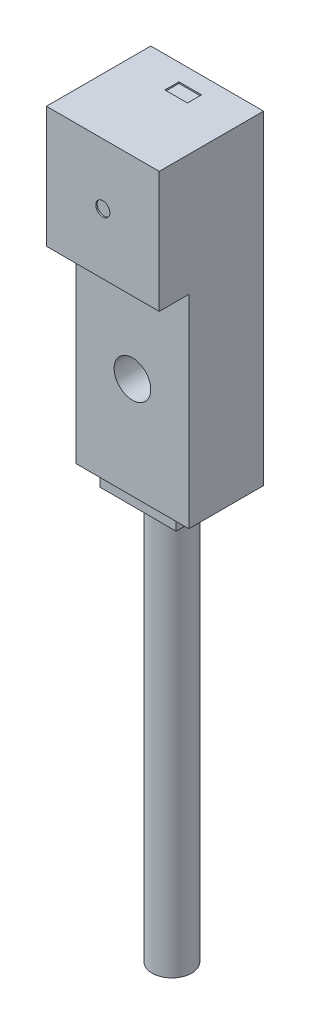
ISO-10303-21;
HEADER;
FILE_DESCRIPTION(('STEP AP214'),'2;1');
FILE_NAME('part.step','',(''),(''),'','','');
FILE_SCHEMA(('AUTOMOTIVE_DESIGN { 1 0 10303 214 1 1 1 1 }'));
ENDSEC;
DATA;
#1=APPLICATION_CONTEXT('core data for automotive mechanical design processes');
#2=APPLICATION_PROTOCOL_DEFINITION('international standard','automotive_design',2000,#1);
#3=PRODUCT_CONTEXT('',#1,'mechanical');
#4=PRODUCT('Part','Part','',(#3));
#5=PRODUCT_RELATED_PRODUCT_CATEGORY('part','',(#4));
#6=PRODUCT_DEFINITION_FORMATION('','',#4);
#7=PRODUCT_DEFINITION_CONTEXT('part definition',#1,'design');
#8=PRODUCT_DEFINITION('design','',#6,#7);
#9=PRODUCT_DEFINITION_SHAPE('','',#8);
#10=(LENGTH_UNIT() NAMED_UNIT(*) SI_UNIT(.MILLI.,.METRE.));
#11=(NAMED_UNIT(*) PLANE_ANGLE_UNIT() SI_UNIT($,.RADIAN.));
#12=(NAMED_UNIT(*) SI_UNIT($,.STERADIAN.) SOLID_ANGLE_UNIT());
#13=UNCERTAINTY_MEASURE_WITH_UNIT(LENGTH_MEASURE(1.E-05),#10,'distance_accuracy_value','');
#14=(GEOMETRIC_REPRESENTATION_CONTEXT(3) GLOBAL_UNCERTAINTY_ASSIGNED_CONTEXT((#13)) GLOBAL_UNIT_ASSIGNED_CONTEXT((#10,
#11,#12)) REPRESENTATION_CONTEXT('',''));
#15=CARTESIAN_POINT('',(0.,0.,0.));
#16=DIRECTION('',(0.,0.,1.));
#17=DIRECTION('',(1.,0.,0.));
#18=AXIS2_PLACEMENT_3D('',#15,#16,#17);
#19=CARTESIAN_POINT('',(1.4168,-48.7,-3.4832));
#20=DIRECTION('',(0.,-1.,0.));
#21=DIRECTION('',(-1.,0.,0.));
#22=AXIS2_PLACEMENT_3D('',#19,#20,#21);
#23=PLANE('',#22);
#24=CARTESIAN_POINT('',(0.,-48.7,-4.9));
#25=DIRECTION('',(0.,-1.,0.));
#26=DIRECTION('',(0.,0.,-1.));
#27=AXIS2_PLACEMENT_3D('',#24,#25,#26);
#28=CIRCLE('',#27,1.4);
#29=CARTESIAN_POINT('',(0.,-48.7,-6.3));
#30=VERTEX_POINT('',#29);
#31=EDGE_CURVE('E18',#30,#30,#28,.T.);
#32=ORIENTED_EDGE('',*,*,#31,.T.);
#33=EDGE_LOOP('',(#32));
#34=FACE_BOUND('',#33,.T.);
#35=ADVANCED_FACE('F14',(#34),#23,.T.);
#36=CARTESIAN_POINT('',(0.,-19.7,-4.9));
#37=DIRECTION('',(0.,-1.,0.));
#38=DIRECTION('',(0.,0.,-1.));
#39=AXIS2_PLACEMENT_3D('',#36,#37,#38);
#40=CYLINDRICAL_SURFACE('',#39,1.4);
#41=ORIENTED_EDGE('',*,*,#31,.F.);
#42=EDGE_LOOP('',(#41));
#43=FACE_BOUND('',#42,.T.);
#44=CARTESIAN_POINT('',(0.,-19.7,-4.9));
#45=DIRECTION('',(0.,-1.,0.));
#46=DIRECTION('',(0.,0.,-1.));
#47=AXIS2_PLACEMENT_3D('',#44,#45,#46);
#48=CIRCLE('',#47,1.4);
#49=CARTESIAN_POINT('',(0.,-19.7,-6.3));
#50=VERTEX_POINT('',#49);
#51=EDGE_CURVE('E159',#50,#50,#48,.T.);
#52=ORIENTED_EDGE('',*,*,#51,.T.);
#53=EDGE_LOOP('',(#52));
#54=FACE_BOUND('',#53,.T.);
#55=ADVANCED_FACE('F300',(#43,#54),#40,.T.);
#56=CARTESIAN_POINT('',(-0.8,4.2,-5.2));
#57=DIRECTION('',(0.,1.,0.));
#58=DIRECTION('',(1.,0.,0.));
#59=AXIS2_PLACEMENT_3D('',#56,#57,#58);
#60=PLANE('',#59);
#61=DIRECTION('',(-1.,0.,0.));
#62=VECTOR('',#61,1.);
#63=CARTESIAN_POINT('',(0.,4.2,-6.2));
#64=LINE('',#63,#62);
#65=CARTESIAN_POINT('',(0.8,4.2,-6.2));
#66=VERTEX_POINT('',#65);
#67=CARTESIAN_POINT('',(-0.8,4.2,-6.2));
#68=VERTEX_POINT('',#67);
#69=EDGE_CURVE('E172',#66,#68,#64,.T.);
#70=ORIENTED_EDGE('',*,*,#69,.T.);
#71=DIRECTION('',(0.,0.,1.));
#72=VECTOR('',#71,1.);
#73=CARTESIAN_POINT('',(-0.8,4.2,-5.7));
#74=LINE('',#73,#72);
#75=CARTESIAN_POINT('',(-0.8,4.2,-5.2));
#76=VERTEX_POINT('',#75);
#77=EDGE_CURVE('E164',#68,#76,#74,.T.);
#78=ORIENTED_EDGE('',*,*,#77,.T.);
#79=DIRECTION('',(1.,0.,0.));
#80=VECTOR('',#79,1.);
#81=CARTESIAN_POINT('',(0.,4.2,-5.2));
#82=LINE('',#81,#80);
#83=CARTESIAN_POINT('',(0.8,4.2,-5.2));
#84=VERTEX_POINT('',#83);
#85=EDGE_CURVE('E161',#76,#84,#82,.T.);
#86=ORIENTED_EDGE('',*,*,#85,.T.);
#87=DIRECTION('',(0.,0.,-1.));
#88=VECTOR('',#87,1.);
#89=CARTESIAN_POINT('',(0.8,4.2,-5.7));
#90=LINE('',#89,#88);
#91=EDGE_CURVE('E181',#84,#66,#90,.T.);
#92=ORIENTED_EDGE('',*,*,#91,.T.);
#93=EDGE_LOOP('',(#70,#78,#86,#92));
#94=FACE_BOUND('',#93,.T.);
#95=ADVANCED_FACE('F303',(#94),#60,.T.);
#96=CARTESIAN_POINT('',(2.7,-19.7,-2.5));
#97=DIRECTION('',(1.,0.,0.));
#98=DIRECTION('',(0.,0.,-1.));
#99=AXIS2_PLACEMENT_3D('',#96,#97,#98);
#100=PLANE('',#99);
#101=DIRECTION('',(0.,0.,1.));
#102=VECTOR('',#101,1.);
#103=CARTESIAN_POINT('',(2.7,-18.7,-4.75));
#104=LINE('',#103,#102);
#105=CARTESIAN_POINT('',(2.7,-18.699999998,-7.4));
#106=VERTEX_POINT('',#105);
#107=CARTESIAN_POINT('',(2.7,-18.7,-2.49999999985));
#108=VERTEX_POINT('',#107);
#109=EDGE_CURVE('E187',#106,#108,#104,.T.);
#110=ORIENTED_EDGE('',*,*,#109,.T.);
#111=DIRECTION('',(0.,1.,0.));
#112=VECTOR('',#111,1.);
#113=CARTESIAN_POINT('',(2.7,-19.2,-2.5));
#114=LINE('',#113,#112);
#115=CARTESIAN_POINT('',(2.7,-19.7,-2.5));
#116=VERTEX_POINT('',#115);
#117=EDGE_CURVE('E113',#116,#108,#114,.T.);
#118=ORIENTED_EDGE('',*,*,#117,.F.);
#119=DIRECTION('',(0.,0.,-1.));
#120=VECTOR('',#119,1.);
#121=CARTESIAN_POINT('',(2.7,-19.7,-4.95));
#122=LINE('',#121,#120);
#123=CARTESIAN_POINT('',(2.7,-19.7,-7.4));
#124=VERTEX_POINT('',#123);
#125=EDGE_CURVE('E137',#116,#124,#122,.T.);
#126=ORIENTED_EDGE('',*,*,#125,.T.);
#127=DIRECTION('',(0.,1.,0.));
#128=VECTOR('',#127,1.);
#129=CARTESIAN_POINT('',(2.7,-19.2,-7.4));
#130=LINE('',#129,#128);
#131=EDGE_CURVE('E145',#124,#106,#130,.T.);
#132=ORIENTED_EDGE('',*,*,#131,.T.);
#133=EDGE_LOOP('',(#110,#118,#126,#132));
#134=FACE_BOUND('',#133,.T.);
#135=ADVANCED_FACE('F310',(#134),#100,.T.);
#136=CARTESIAN_POINT('',(-2.7,-19.7,-2.5));
#137=DIRECTION('',(0.,0.,1.));
#138=DIRECTION('',(1.,0.,0.));
#139=AXIS2_PLACEMENT_3D('',#136,#137,#138);
#140=PLANE('',#139);
#141=DIRECTION('',(-1.,0.,0.));
#142=VECTOR('',#141,1.);
#143=CARTESIAN_POINT('',(0.,-18.7,-2.4999999994));
#144=LINE('',#143,#142);
#145=CARTESIAN_POINT('',(-2.7,-18.7,-2.49999999985));
#146=VERTEX_POINT('',#145);
#147=EDGE_CURVE('E124',#108,#146,#144,.T.);
#148=ORIENTED_EDGE('',*,*,#147,.T.);
#149=DIRECTION('',(0.,1.,0.));
#150=VECTOR('',#149,1.);
#151=CARTESIAN_POINT('',(-2.7,-19.2,-2.5));
#152=LINE('',#151,#150);
#153=CARTESIAN_POINT('',(-2.7,-19.7,-2.5));
#154=VERTEX_POINT('',#153);
#155=EDGE_CURVE('E119',#154,#146,#152,.T.);
#156=ORIENTED_EDGE('',*,*,#155,.F.);
#157=DIRECTION('',(1.,0.,0.));
#158=VECTOR('',#157,1.);
#159=CARTESIAN_POINT('',(0.,-19.7,-2.5));
#160=LINE('',#159,#158);
#161=EDGE_CURVE('E122',#154,#116,#160,.T.);
#162=ORIENTED_EDGE('',*,*,#161,.T.);
#163=ORIENTED_EDGE('',*,*,#117,.T.);
#164=EDGE_LOOP('',(#148,#156,#162,#163));
#165=FACE_BOUND('',#164,.T.);
#166=ADVANCED_FACE('F121',(#165),#140,.T.);
#167=CARTESIAN_POINT('',(-2.7,-19.7,-7.4));
#168=DIRECTION('',(-1.,0.,0.));
#169=DIRECTION('',(0.,0.,1.));
#170=AXIS2_PLACEMENT_3D('',#167,#168,#169);
#171=PLANE('',#170);
#172=DIRECTION('',(0.,0.,-1.));
#173=VECTOR('',#172,1.);
#174=CARTESIAN_POINT('',(-2.7,-18.7,-4.75));
#175=LINE('',#174,#173);
#176=CARTESIAN_POINT('',(-2.7,-18.699999998,-7.4));
#177=VERTEX_POINT('',#176);
#178=EDGE_CURVE('E190',#146,#177,#175,.T.);
#179=ORIENTED_EDGE('',*,*,#178,.T.);
#180=DIRECTION('',(0.,-1.,0.));
#181=VECTOR('',#180,1.);
#182=CARTESIAN_POINT('',(-2.7,-19.2,-7.4));
#183=LINE('',#182,#181);
#184=CARTESIAN_POINT('',(-2.7,-19.7,-7.4));
#185=VERTEX_POINT('',#184);
#186=EDGE_CURVE('E129',#177,#185,#183,.T.);
#187=ORIENTED_EDGE('',*,*,#186,.T.);
#188=DIRECTION('',(0.,0.,1.));
#189=VECTOR('',#188,1.);
#190=CARTESIAN_POINT('',(-2.7,-19.7,-4.95));
#191=LINE('',#190,#189);
#192=EDGE_CURVE('E135',#185,#154,#191,.T.);
#193=ORIENTED_EDGE('',*,*,#192,.T.);
#194=ORIENTED_EDGE('',*,*,#155,.T.);
#195=EDGE_LOOP('',(#179,#187,#193,#194));
#196=FACE_BOUND('',#195,.T.);
#197=ADVANCED_FACE('F139',(#196),#171,.T.);
#198=CARTESIAN_POINT('',(-2.7,-19.7,-2.5));
#199=DIRECTION('',(0.,1.,0.));
#200=DIRECTION('',(1.,0.,0.));
#201=AXIS2_PLACEMENT_3D('',#198,#199,#200);
#202=PLANE('',#201);
#203=ORIENTED_EDGE('',*,*,#51,.F.);
#204=EDGE_LOOP('',(#203));
#205=FACE_BOUND('',#204,.T.);
#206=ORIENTED_EDGE('',*,*,#161,.F.);
#207=ORIENTED_EDGE('',*,*,#192,.F.);
#208=DIRECTION('',(-1.,0.,0.));
#209=VECTOR('',#208,1.);
#210=CARTESIAN_POINT('',(0.,-19.7,-7.4));
#211=LINE('',#210,#209);
#212=EDGE_CURVE('E157',#124,#185,#211,.T.);
#213=ORIENTED_EDGE('',*,*,#212,.F.);
#214=ORIENTED_EDGE('',*,*,#125,.F.);
#215=EDGE_LOOP('',(#206,#207,#213,#214));
#216=FACE_BOUND('',#215,.T.);
#217=ADVANCED_FACE('F133',(#205,#216),#202,.F.);
#218=CARTESIAN_POINT('',(0.,-11.5,-2.1));
#219=DIRECTION('',(0.,0.,-1.));
#220=DIRECTION('',(-1.,0.,0.));
#221=AXIS2_PLACEMENT_3D('',#218,#219,#220);
#222=CYLINDRICAL_SURFACE('',#221,1.3);
#223=CARTESIAN_POINT('',(0.,-11.5,-7.4));
#224=DIRECTION('',(0.,0.,-1.));
#225=DIRECTION('',(-1.,0.,0.));
#226=AXIS2_PLACEMENT_3D('',#223,#224,#225);
#227=CIRCLE('',#226,1.3);
#228=CARTESIAN_POINT('',(-1.3,-11.5,-7.4));
#229=VERTEX_POINT('',#228);
#230=EDGE_CURVE('E150',#229,#229,#227,.F.);
#231=ORIENTED_EDGE('',*,*,#230,.F.);
#232=EDGE_LOOP('',(#231));
#233=FACE_BOUND('',#232,.T.);
#234=CARTESIAN_POINT('',(0.,-11.5,-2.1));
#235=DIRECTION('',(0.,0.,-1.));
#236=DIRECTION('',(-1.,0.,0.));
#237=AXIS2_PLACEMENT_3D('',#234,#235,#236);
#238=CIRCLE('',#237,1.3);
#239=CARTESIAN_POINT('',(-1.3,-11.5,-2.1));
#240=VERTEX_POINT('',#239);
#241=EDGE_CURVE('E155',#240,#240,#238,.F.);
#242=ORIENTED_EDGE('',*,*,#241,.T.);
#243=EDGE_LOOP('',(#242));
#244=FACE_BOUND('',#243,.T.);
#245=ADVANCED_FACE('F295',(#233,#244),#222,.F.);
#246=CARTESIAN_POINT('',(-0.8,4.2,-5.2));
#247=DIRECTION('',(0.,0.,1.));
#248=DIRECTION('',(1.,0.,0.));
#249=AXIS2_PLACEMENT_3D('',#246,#247,#248);
#250=PLANE('',#249);
#251=DIRECTION('',(0.,-1.,0.));
#252=VECTOR('',#251,1.);
#253=CARTESIAN_POINT('',(0.8,4.25,-5.2));
#254=LINE('',#253,#252);
#255=CARTESIAN_POINT('',(0.8,4.3,-5.20000000055));
#256=VERTEX_POINT('',#255);
#257=EDGE_CURVE('E178',#256,#84,#254,.T.);
#258=ORIENTED_EDGE('',*,*,#257,.T.);
#259=ORIENTED_EDGE('',*,*,#85,.F.);
#260=DIRECTION('',(0.,1.,0.));
#261=VECTOR('',#260,1.);
#262=CARTESIAN_POINT('',(-0.8,4.25,-5.2));
#263=LINE('',#262,#261);
#264=CARTESIAN_POINT('',(-0.8,4.3,-5.20000000055));
#265=VERTEX_POINT('',#264);
#266=EDGE_CURVE('E169',#76,#265,#263,.T.);
#267=ORIENTED_EDGE('',*,*,#266,.T.);
#268=DIRECTION('',(-1.,0.,0.));
#269=VECTOR('',#268,1.);
#270=CARTESIAN_POINT('',(0.,4.3,-5.2000000022));
#271=LINE('',#270,#269);
#272=EDGE_CURVE('E200',#256,#265,#271,.T.);
#273=ORIENTED_EDGE('',*,*,#272,.F.);
#274=EDGE_LOOP('',(#258,#259,#267,#273));
#275=FACE_BOUND('',#274,.T.);
#276=ADVANCED_FACE('F298',(#275),#250,.F.);
#277=CARTESIAN_POINT('',(-0.8,4.2,-6.2));
#278=DIRECTION('',(-1.,0.,0.));
#279=DIRECTION('',(0.,0.,1.));
#280=AXIS2_PLACEMENT_3D('',#277,#278,#279);
#281=PLANE('',#280);
#282=ORIENTED_EDGE('',*,*,#266,.F.);
#283=ORIENTED_EDGE('',*,*,#77,.F.);
#284=DIRECTION('',(0.,1.,0.));
#285=VECTOR('',#284,1.);
#286=CARTESIAN_POINT('',(-0.8,4.25,-6.2));
#287=LINE('',#286,#285);
#288=CARTESIAN_POINT('',(-0.8,4.3,-6.2000000003));
#289=VERTEX_POINT('',#288);
#290=EDGE_CURVE('E175',#68,#289,#287,.T.);
#291=ORIENTED_EDGE('',*,*,#290,.T.);
#292=DIRECTION('',(0.,0.,-1.));
#293=VECTOR('',#292,1.);
#294=CARTESIAN_POINT('',(-0.8,4.3,-3.7));
#295=LINE('',#294,#293);
#296=EDGE_CURVE('E202',#265,#289,#295,.T.);
#297=ORIENTED_EDGE('',*,*,#296,.F.);
#298=EDGE_LOOP('',(#282,#283,#291,#297));
#299=FACE_BOUND('',#298,.T.);
#300=ADVANCED_FACE('F323',(#299),#281,.F.);
#301=CARTESIAN_POINT('',(0.8,4.2,-6.2));
#302=DIRECTION('',(0.,0.,-1.));
#303=DIRECTION('',(-1.,0.,0.));
#304=AXIS2_PLACEMENT_3D('',#301,#302,#303);
#305=PLANE('',#304);
#306=ORIENTED_EDGE('',*,*,#290,.F.);
#307=ORIENTED_EDGE('',*,*,#69,.F.);
#308=DIRECTION('',(0.,1.,0.));
#309=VECTOR('',#308,1.);
#310=CARTESIAN_POINT('',(0.8,4.25,-6.2));
#311=LINE('',#310,#309);
#312=CARTESIAN_POINT('',(0.8,4.3,-6.2000000003));
#313=VERTEX_POINT('',#312);
#314=EDGE_CURVE('E184',#66,#313,#311,.T.);
#315=ORIENTED_EDGE('',*,*,#314,.T.);
#316=DIRECTION('',(1.,0.,0.));
#317=VECTOR('',#316,1.);
#318=CARTESIAN_POINT('',(0.,4.3,-6.2000000012));
#319=LINE('',#318,#317);
#320=EDGE_CURVE('E204',#289,#313,#319,.T.);
#321=ORIENTED_EDGE('',*,*,#320,.F.);
#322=EDGE_LOOP('',(#306,#307,#315,#321));
#323=FACE_BOUND('',#322,.T.);
#324=ADVANCED_FACE('F327',(#323),#305,.F.);
#325=CARTESIAN_POINT('',(0.8,4.2,-5.2));
#326=DIRECTION('',(1.,0.,0.));
#327=DIRECTION('',(0.,0.,-1.));
#328=AXIS2_PLACEMENT_3D('',#325,#326,#327);
#329=PLANE('',#328);
#330=ORIENTED_EDGE('',*,*,#314,.F.);
#331=ORIENTED_EDGE('',*,*,#91,.F.);
#332=ORIENTED_EDGE('',*,*,#257,.F.);
#333=DIRECTION('',(0.,0.,1.));
#334=VECTOR('',#333,1.);
#335=CARTESIAN_POINT('',(0.800000000000001,4.3,-3.7));
#336=LINE('',#335,#334);
#337=EDGE_CURVE('E206',#313,#256,#336,.T.);
#338=ORIENTED_EDGE('',*,*,#337,.F.);
#339=EDGE_LOOP('',(#330,#331,#332,#338));
#340=FACE_BOUND('',#339,.T.);
#341=ADVANCED_FACE('F281',(#340),#329,.F.);
#342=CARTESIAN_POINT('',(-4.,-18.7,-2.1));
#343=DIRECTION('',(0.,1.,0.));
#344=DIRECTION('',(1.,0.,0.));
#345=AXIS2_PLACEMENT_3D('',#342,#343,#344);
#346=PLANE('',#345);
#347=ORIENTED_EDGE('',*,*,#178,.F.);
#348=ORIENTED_EDGE('',*,*,#147,.F.);
#349=ORIENTED_EDGE('',*,*,#109,.F.);
#350=DIRECTION('',(-1.,0.,0.));
#351=VECTOR('',#350,1.);
#352=CARTESIAN_POINT('',(0.,-18.699999992,-7.4));
#353=LINE('',#352,#351);
#354=CARTESIAN_POINT('',(4.,-18.699999998,-7.4));
#355=VERTEX_POINT('',#354);
#356=EDGE_CURVE('E154',#355,#106,#353,.T.);
#357=ORIENTED_EDGE('',*,*,#356,.F.);
#358=DIRECTION('',(0.,0.,-1.));
#359=VECTOR('',#358,1.);
#360=CARTESIAN_POINT('',(4.,-18.7,-3.7));
#361=LINE('',#360,#359);
#362=CARTESIAN_POINT('',(4.,-18.7,-2.1000000004));
#363=VERTEX_POINT('',#362);
#364=EDGE_CURVE('E209',#363,#355,#361,.T.);
#365=ORIENTED_EDGE('',*,*,#364,.F.);
#366=DIRECTION('',(-1.,0.,0.));
#367=VECTOR('',#366,1.);
#368=CARTESIAN_POINT('',(0.,-18.7,-2.1));
#369=LINE('',#368,#367);
#370=CARTESIAN_POINT('',(-4.,-18.7,-2.1000000004));
#371=VERTEX_POINT('',#370);
#372=EDGE_CURVE('E158',#363,#371,#369,.T.);
#373=ORIENTED_EDGE('',*,*,#372,.T.);
#374=DIRECTION('',(0.,0.,1.));
#375=VECTOR('',#374,1.);
#376=CARTESIAN_POINT('',(-4.,-18.7,-3.7));
#377=LINE('',#376,#375);
#378=CARTESIAN_POINT('',(-4.,-18.699999998,-7.4));
#379=VERTEX_POINT('',#378);
#380=EDGE_CURVE('E224',#379,#371,#377,.T.);
#381=ORIENTED_EDGE('',*,*,#380,.F.);
#382=DIRECTION('',(-1.,0.,0.));
#383=VECTOR('',#382,1.);
#384=CARTESIAN_POINT('',(0.,-18.699999992,-7.4));
#385=LINE('',#384,#383);
#386=EDGE_CURVE('E195',#177,#379,#385,.T.);
#387=ORIENTED_EDGE('',*,*,#386,.F.);
#388=EDGE_LOOP('',(#347,#348,#349,#357,#365,#373,#381,#387));
#389=FACE_BOUND('',#388,.T.);
#390=ADVANCED_FACE('F266',(#389),#346,.F.);
#391=CARTESIAN_POINT('',(4.,-18.7,-2.1));
#392=DIRECTION('',(0.,0.,-1.));
#393=DIRECTION('',(-1.,0.,0.));
#394=AXIS2_PLACEMENT_3D('',#391,#392,#393);
#395=PLANE('',#394);
#396=ORIENTED_EDGE('',*,*,#241,.F.);
#397=EDGE_LOOP('',(#396));
#398=FACE_BOUND('',#397,.T.);
#399=ORIENTED_EDGE('',*,*,#372,.F.);
#400=DIRECTION('',(0.,-1.,0.));
#401=VECTOR('',#400,1.);
#402=CARTESIAN_POINT('',(4.,-7.2,-2.1000000016));
#403=LINE('',#402,#401);
#404=CARTESIAN_POINT('',(4.,-4.29999999725,-2.1000000004));
#405=VERTEX_POINT('',#404);
#406=EDGE_CURVE('E215',#405,#363,#403,.T.);
#407=ORIENTED_EDGE('',*,*,#406,.F.);
#408=DIRECTION('',(-1.,0.,0.));
#409=VECTOR('',#408,1.);
#410=CARTESIAN_POINT('',(0.,-4.3,-2.1));
#411=LINE('',#410,#409);
#412=CARTESIAN_POINT('',(-4.,-4.29999999725,-2.1000000004));
#413=VERTEX_POINT('',#412);
#414=EDGE_CURVE('E218',#405,#413,#411,.T.);
#415=ORIENTED_EDGE('',*,*,#414,.T.);
#416=DIRECTION('',(0.,1.,0.));
#417=VECTOR('',#416,1.);
#418=CARTESIAN_POINT('',(-4.,-7.2,-2.1000000016));
#419=LINE('',#418,#417);
#420=EDGE_CURVE('E226',#371,#413,#419,.T.);
#421=ORIENTED_EDGE('',*,*,#420,.F.);
#422=EDGE_LOOP('',(#399,#407,#415,#421));
#423=FACE_BOUND('',#422,.T.);
#424=ADVANCED_FACE('F270',(#398,#423),#395,.F.);
#425=CARTESIAN_POINT('',(4.,-19.7,-7.4));
#426=DIRECTION('',(0.,0.,-1.));
#427=DIRECTION('',(-1.,0.,0.));
#428=AXIS2_PLACEMENT_3D('',#425,#426,#427);
#429=PLANE('',#428);
#430=ORIENTED_EDGE('',*,*,#230,.T.);
#431=EDGE_LOOP('',(#430));
#432=FACE_BOUND('',#431,.T.);
#433=ORIENTED_EDGE('',*,*,#356,.T.);
#434=ORIENTED_EDGE('',*,*,#131,.F.);
#435=ORIENTED_EDGE('',*,*,#212,.T.);
#436=ORIENTED_EDGE('',*,*,#186,.F.);
#437=ORIENTED_EDGE('',*,*,#386,.T.);
#438=DIRECTION('',(0.,-1.,0.));
#439=VECTOR('',#438,1.);
#440=CARTESIAN_POINT('',(-4.,-7.2,-7.4));
#441=LINE('',#440,#439);
#442=CARTESIAN_POINT('',(-4.,4.3,-7.4));
#443=VERTEX_POINT('',#442);
#444=EDGE_CURVE('E232',#443,#379,#441,.T.);
#445=ORIENTED_EDGE('',*,*,#444,.F.);
#446=DIRECTION('',(-1.,0.,0.));
#447=VECTOR('',#446,1.);
#448=CARTESIAN_POINT('',(0.,4.3,-7.4));
#449=LINE('',#448,#447);
#450=CARTESIAN_POINT('',(4.,4.3,-7.4));
#451=VERTEX_POINT('',#450);
#452=EDGE_CURVE('E153',#451,#443,#449,.T.);
#453=ORIENTED_EDGE('',*,*,#452,.F.);
#454=DIRECTION('',(0.,1.,0.));
#455=VECTOR('',#454,1.);
#456=CARTESIAN_POINT('',(4.,-7.2,-7.4));
#457=LINE('',#456,#455);
#458=EDGE_CURVE('E211',#355,#451,#457,.T.);
#459=ORIENTED_EDGE('',*,*,#458,.F.);
#460=EDGE_LOOP('',(#433,#434,#435,#436,#437,#445,#453,#459));
#461=FACE_BOUND('',#460,.T.);
#462=ADVANCED_FACE('F262',(#432,#461),#429,.T.);
#463=CARTESIAN_POINT('',(-4.,4.3,0.));
#464=DIRECTION('',(0.,1.,0.));
#465=DIRECTION('',(1.,0.,0.));
#466=AXIS2_PLACEMENT_3D('',#463,#464,#465);
#467=PLANE('',#466);
#468=ORIENTED_EDGE('',*,*,#320,.T.);
#469=ORIENTED_EDGE('',*,*,#337,.T.);
#470=ORIENTED_EDGE('',*,*,#272,.T.);
#471=ORIENTED_EDGE('',*,*,#296,.T.);
#472=EDGE_LOOP('',(#468,#469,#470,#471));
#473=FACE_BOUND('',#472,.T.);
#474=DIRECTION('',(1.,0.,0.));
#475=VECTOR('',#474,1.);
#476=CARTESIAN_POINT('',(0.,4.3,0.));
#477=LINE('',#476,#475);
#478=CARTESIAN_POINT('',(-4.,4.3,0.));
#479=VERTEX_POINT('',#478);
#480=CARTESIAN_POINT('',(4.,4.3,0.));
#481=VERTEX_POINT('',#480);
#482=EDGE_CURVE('E235',#479,#481,#477,.T.);
#483=ORIENTED_EDGE('',*,*,#482,.T.);
#484=DIRECTION('',(0.,0.,1.));
#485=VECTOR('',#484,1.);
#486=CARTESIAN_POINT('',(4.,4.3,-3.7));
#487=LINE('',#486,#485);
#488=EDGE_CURVE('E213',#451,#481,#487,.T.);
#489=ORIENTED_EDGE('',*,*,#488,.F.);
#490=ORIENTED_EDGE('',*,*,#452,.T.);
#491=DIRECTION('',(0.,0.,-1.));
#492=VECTOR('',#491,1.);
#493=CARTESIAN_POINT('',(-4.,4.3,-3.7));
#494=LINE('',#493,#492);
#495=EDGE_CURVE('E229',#479,#443,#494,.T.);
#496=ORIENTED_EDGE('',*,*,#495,.F.);
#497=EDGE_LOOP('',(#483,#489,#490,#496));
#498=FACE_BOUND('',#497,.T.);
#499=ADVANCED_FACE('F258',(#473,#498),#467,.T.);
#500=CARTESIAN_POINT('',(4.,4.3,0.));
#501=DIRECTION('',(1.,0.,0.));
#502=DIRECTION('',(0.,-1.,0.));
#503=AXIS2_PLACEMENT_3D('',#500,#501,#502);
#504=PLANE('',#503);
#505=DIRECTION('',(0.,0.,-1.));
#506=VECTOR('',#505,1.);
#507=CARTESIAN_POINT('',(4.,-4.3,-1.05));
#508=LINE('',#507,#506);
#509=CARTESIAN_POINT('',(4.,-4.2999999945,0.));
#510=VERTEX_POINT('',#509);
#511=EDGE_CURVE('E221',#510,#405,#508,.T.);
#512=ORIENTED_EDGE('',*,*,#511,.T.);
#513=ORIENTED_EDGE('',*,*,#406,.T.);
#514=ORIENTED_EDGE('',*,*,#364,.T.);
#515=ORIENTED_EDGE('',*,*,#458,.T.);
#516=ORIENTED_EDGE('',*,*,#488,.T.);
#517=DIRECTION('',(0.,-1.,0.));
#518=VECTOR('',#517,1.);
#519=CARTESIAN_POINT('',(4.,0.,0.));
#520=LINE('',#519,#518);
#521=EDGE_CURVE('E238',#481,#510,#520,.T.);
#522=ORIENTED_EDGE('',*,*,#521,.T.);
#523=EDGE_LOOP('',(#512,#513,#514,#515,#516,#522));
#524=FACE_BOUND('',#523,.T.);
#525=ADVANCED_FACE('F254',(#524),#504,.T.);
#526=CARTESIAN_POINT('',(-4.,-4.3,0.));
#527=DIRECTION('',(0.,1.,0.));
#528=DIRECTION('',(1.,0.,0.));
#529=AXIS2_PLACEMENT_3D('',#526,#527,#528);
#530=PLANE('',#529);
#531=DIRECTION('',(-1.,0.,0.));
#532=VECTOR('',#531,1.);
#533=CARTESIAN_POINT('',(0.,-4.3,0.));
#534=LINE('',#533,#532);
#535=CARTESIAN_POINT('',(-4.,-4.29999999725,0.));
#536=VERTEX_POINT('',#535);
#537=EDGE_CURVE('E241',#510,#536,#534,.T.);
#538=ORIENTED_EDGE('',*,*,#537,.T.);
#539=DIRECTION('',(0.,0.,1.));
#540=VECTOR('',#539,1.);
#541=CARTESIAN_POINT('',(-4.,-4.299999989,-3.7));
#542=LINE('',#541,#540);
#543=EDGE_CURVE('E33',#413,#536,#542,.T.);
#544=ORIENTED_EDGE('',*,*,#543,.F.);
#545=ORIENTED_EDGE('',*,*,#414,.F.);
#546=ORIENTED_EDGE('',*,*,#511,.F.);
#547=EDGE_LOOP('',(#538,#544,#545,#546));
#548=FACE_BOUND('',#547,.T.);
#549=ADVANCED_FACE('F251',(#548),#530,.F.);
#550=CARTESIAN_POINT('',(-4.,-18.7,0.));
#551=DIRECTION('',(-1.,0.,0.));
#552=DIRECTION('',(0.,1.,0.));
#553=AXIS2_PLACEMENT_3D('',#550,#551,#552);
#554=PLANE('',#553);
#555=ORIENTED_EDGE('',*,*,#495,.T.);
#556=ORIENTED_EDGE('',*,*,#444,.T.);
#557=ORIENTED_EDGE('',*,*,#380,.T.);
#558=ORIENTED_EDGE('',*,*,#420,.T.);
#559=ORIENTED_EDGE('',*,*,#543,.T.);
#560=DIRECTION('',(0.,1.,0.));
#561=VECTOR('',#560,1.);
#562=CARTESIAN_POINT('',(-4.,0.,0.));
#563=LINE('',#562,#561);
#564=EDGE_CURVE('E149',#536,#479,#563,.T.);
#565=ORIENTED_EDGE('',*,*,#564,.T.);
#566=EDGE_LOOP('',(#555,#556,#557,#558,#559,#565));
#567=FACE_BOUND('',#566,.T.);
#568=ADVANCED_FACE('F244',(#567),#554,.T.);
#569=CARTESIAN_POINT('',(-0.506,-0.506,-0.1));
#570=DIRECTION('',(0.,0.,1.));
#571=DIRECTION('',(1.,0.,0.));
#572=AXIS2_PLACEMENT_3D('',#569,#570,#571);
#573=PLANE('',#572);
#574=CARTESIAN_POINT('',(0.,0.,-0.1));
#575=DIRECTION('',(0.,0.,1.));
#576=DIRECTION('',(1.,0.,0.));
#577=AXIS2_PLACEMENT_3D('',#574,#575,#576);
#578=CIRCLE('',#577,0.5);
#579=CARTESIAN_POINT('',(0.5,0.,-0.1));
#580=VERTEX_POINT('',#579);
#581=EDGE_CURVE('E24',#580,#580,#578,.F.);
#582=ORIENTED_EDGE('',*,*,#581,.F.);
#583=EDGE_LOOP('',(#582));
#584=FACE_BOUND('',#583,.T.);
#585=ADVANCED_FACE('F291',(#584),#573,.T.);
#586=CARTESIAN_POINT('',(4.,-4.3,0.));
#587=DIRECTION('',(0.,0.,-1.));
#588=DIRECTION('',(-1.,0.,0.));
#589=AXIS2_PLACEMENT_3D('',#586,#587,#588);
#590=PLANE('',#589);
#591=CARTESIAN_POINT('',(0.,0.,0.));
#592=DIRECTION('',(0.,0.,1.));
#593=DIRECTION('',(1.,0.,0.));
#594=AXIS2_PLACEMENT_3D('',#591,#592,#593);
#595=CIRCLE('',#594,0.5);
#596=CARTESIAN_POINT('',(0.5,0.,0.));
#597=VERTEX_POINT('',#596);
#598=EDGE_CURVE('E9',#597,#597,#595,.T.);
#599=ORIENTED_EDGE('',*,*,#598,.F.);
#600=EDGE_LOOP('',(#599));
#601=FACE_BOUND('',#600,.T.);
#602=ORIENTED_EDGE('',*,*,#537,.F.);
#603=ORIENTED_EDGE('',*,*,#521,.F.);
#604=ORIENTED_EDGE('',*,*,#482,.F.);
#605=ORIENTED_EDGE('',*,*,#564,.F.);
#606=EDGE_LOOP('',(#602,#603,#604,#605));
#607=FACE_BOUND('',#606,.T.);
#608=ADVANCED_FACE('F16',(#601,#607),#590,.F.);
#609=CARTESIAN_POINT('',(0.,0.,-0.1));
#610=DIRECTION('',(0.,0.,1.));
#611=DIRECTION('',(1.,0.,0.));
#612=AXIS2_PLACEMENT_3D('',#609,#610,#611);
#613=CYLINDRICAL_SURFACE('',#612,0.5);
#614=ORIENTED_EDGE('',*,*,#598,.T.);
#615=EDGE_LOOP('',(#614));
#616=FACE_BOUND('',#615,.T.);
#617=ORIENTED_EDGE('',*,*,#581,.T.);
#618=EDGE_LOOP('',(#617));
#619=FACE_BOUND('',#618,.T.);
#620=ADVANCED_FACE('F284',(#616,#619),#613,.F.);
#621=CLOSED_SHELL('',(#35,#55,#95,#135,#166,#197,#217,#245,#276,#300,#324,#341,#390,#424,#462,
#499,#525,#549,#568,#585,#608,#620));
#622=MANIFOLD_SOLID_BREP('B1',#621);
#623=ADVANCED_BREP_SHAPE_REPRESENTATION('',(#18,#622),#14);
#624=SHAPE_DEFINITION_REPRESENTATION(#9,#623);
ENDSEC;
END-ISO-10303-21;
